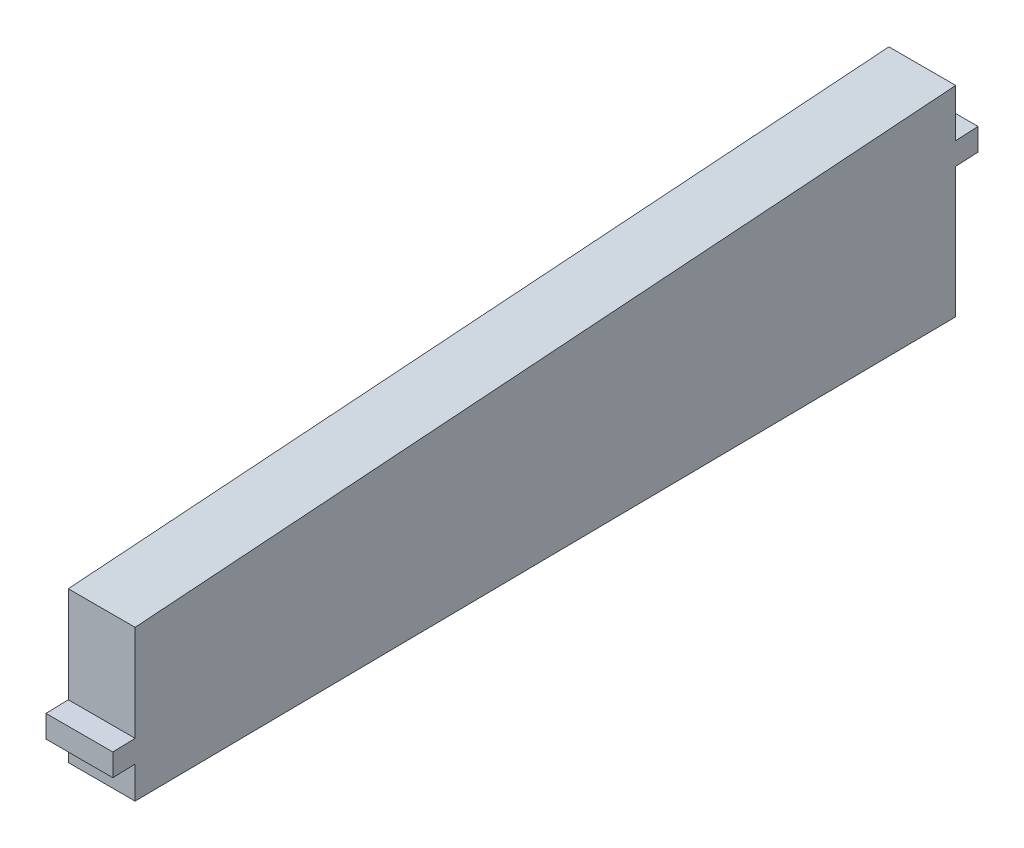
ISO-10303-21;
HEADER;
FILE_DESCRIPTION(('STEP AP214'),'2;1');
FILE_NAME('part.step','',(''),(''),'','','');
FILE_SCHEMA(('AUTOMOTIVE_DESIGN { 1 0 10303 214 1 1 1 1 }'));
ENDSEC;
DATA;
#1=APPLICATION_CONTEXT('core data for automotive mechanical design processes');
#2=APPLICATION_PROTOCOL_DEFINITION('international standard','automotive_design',2000,#1);
#3=PRODUCT_CONTEXT('',#1,'mechanical');
#4=PRODUCT('Part','Part','',(#3));
#5=PRODUCT_RELATED_PRODUCT_CATEGORY('part','',(#4));
#6=PRODUCT_DEFINITION_FORMATION('','',#4);
#7=PRODUCT_DEFINITION_CONTEXT('part definition',#1,'design');
#8=PRODUCT_DEFINITION('design','',#6,#7);
#9=PRODUCT_DEFINITION_SHAPE('','',#8);
#10=(LENGTH_UNIT() NAMED_UNIT(*) SI_UNIT(.MILLI.,.METRE.));
#11=(NAMED_UNIT(*) PLANE_ANGLE_UNIT() SI_UNIT($,.RADIAN.));
#12=(NAMED_UNIT(*) SI_UNIT($,.STERADIAN.) SOLID_ANGLE_UNIT());
#13=UNCERTAINTY_MEASURE_WITH_UNIT(LENGTH_MEASURE(1.E-05),#10,'distance_accuracy_value','');
#14=(GEOMETRIC_REPRESENTATION_CONTEXT(3) GLOBAL_UNCERTAINTY_ASSIGNED_CONTEXT((#13)) GLOBAL_UNIT_ASSIGNED_CONTEXT((#10,
#11,#12)) REPRESENTATION_CONTEXT('',''));
#15=CARTESIAN_POINT('',(0.,0.,0.));
#16=DIRECTION('',(0.,0.,1.));
#17=DIRECTION('',(1.,0.,0.));
#18=AXIS2_PLACEMENT_3D('',#15,#16,#17);
#19=CARTESIAN_POINT('',(243.017706630706,0.,0.));
#20=DIRECTION('',(1.,0.,0.));
#21=DIRECTION('',(0.,0.,-1.));
#22=AXIS2_PLACEMENT_3D('',#19,#20,#21);
#23=PLANE('',#22);
#24=DIRECTION('',(0.,-0.0302886855911997,0.999541192510423));
#25=VECTOR('',#24,1.);
#26=CARTESIAN_POINT('',(243.017706630706,362.929859581874,1377.48536065991));
#27=LINE('',#26,#25);
#28=CARTESIAN_POINT('',(243.017706630706,362.929859581874,1377.48536065991));
#29=VERTEX_POINT('',#28);
#30=CARTESIAN_POINT('',(243.017706630706,362.833648862923,1380.66036065991));
#31=VERTEX_POINT('',#30);
#32=EDGE_CURVE('E133',#29,#31,#27,.T.);
#33=ORIENTED_EDGE('',*,*,#32,.F.);
#34=DIRECTION('',(0.,-1.,0.));
#35=VECTOR('',#34,1.);
#36=CARTESIAN_POINT('',(243.017706630706,376.630450656221,1377.48536065991));
#37=LINE('',#36,#35);
#38=CARTESIAN_POINT('',(243.017706630706,376.630450656221,1377.48536065991));
#39=VERTEX_POINT('',#38);
#40=EDGE_CURVE('E169',#39,#29,#37,.T.);
#41=ORIENTED_EDGE('',*,*,#40,.F.);
#42=DIRECTION('',(0.,-0.0717092650954965,0.997425576822383));
#43=VECTOR('',#42,1.);
#44=CARTESIAN_POINT('',(243.017706630706,385.038195501593,1260.53952749591));
#45=LINE('',#44,#43);
#46=CARTESIAN_POINT('',(243.017706630706,385.038195501593,1260.53952749591));
#47=VERTEX_POINT('',#46);
#48=EDGE_CURVE('E166',#47,#39,#45,.T.);
#49=ORIENTED_EDGE('',*,*,#48,.F.);
#50=DIRECTION('',(0.,1.,0.));
#51=VECTOR('',#50,1.);
#52=CARTESIAN_POINT('',(243.017706630706,378.224679306953,1260.53952749591));
#53=LINE('',#52,#51);
#54=CARTESIAN_POINT('',(243.017706630706,378.224679306953,1260.53952749591));
#55=VERTEX_POINT('',#54);
#56=EDGE_CURVE('E163',#55,#47,#53,.T.);
#57=ORIENTED_EDGE('',*,*,#56,.F.);
#58=DIRECTION('',(0.,-0.0527109798388338,0.99860980998808));
#59=VECTOR('',#58,1.);
#60=CARTESIAN_POINT('',(243.017706630706,378.392269650363,1257.36452749591));
#61=LINE('',#60,#59);
#62=CARTESIAN_POINT('',(243.017706630706,378.392269650363,1257.36452749591));
#63=VERTEX_POINT('',#62);
#64=EDGE_CURVE('E160',#63,#55,#61,.T.);
#65=ORIENTED_EDGE('',*,*,#64,.F.);
#66=DIRECTION('',(0.,1.,0.));
#67=VECTOR('',#66,1.);
#68=CARTESIAN_POINT('',(243.017706630706,375.217269650363,1257.36452749591));
#69=LINE('',#68,#67);
#70=CARTESIAN_POINT('',(243.017706630706,375.217269650363,1257.36452749591));
#71=VERTEX_POINT('',#70);
#72=EDGE_CURVE('E157',#71,#63,#69,.T.);
#73=ORIENTED_EDGE('',*,*,#72,.F.);
#74=DIRECTION('',(0.,0.0527109798388512,-0.998609809988079));
#75=VECTOR('',#74,1.);
#76=CARTESIAN_POINT('',(243.017706630706,375.049679306953,1260.53952749591));
#77=LINE('',#76,#75);
#78=CARTESIAN_POINT('',(243.017706630706,375.049679306953,1260.53952749591));
#79=VERTEX_POINT('',#78);
#80=EDGE_CURVE('E154',#79,#71,#77,.T.);
#81=ORIENTED_EDGE('',*,*,#80,.F.);
#82=DIRECTION('',(0.,1.,0.));
#83=VECTOR('',#82,1.);
#84=CARTESIAN_POINT('',(243.017706630706,356.485104863458,1260.53952749591));
#85=LINE('',#84,#83);
#86=CARTESIAN_POINT('',(243.017706630706,356.485104863458,1260.53952749591));
#87=VERTEX_POINT('',#86);
#88=EDGE_CURVE('E151',#87,#79,#85,.T.);
#89=ORIENTED_EDGE('',*,*,#88,.F.);
#90=DIRECTION('',(0.,0.0111918961884356,-0.999937368768518));
#91=VECTOR('',#90,1.);
#92=CARTESIAN_POINT('',(243.017706630706,355.176177259268,1377.48536065991));
#93=LINE('',#92,#91);
#94=CARTESIAN_POINT('',(243.017706630706,355.176177259268,1377.48536065991));
#95=VERTEX_POINT('',#94);
#96=EDGE_CURVE('E148',#95,#87,#93,.T.);
#97=ORIENTED_EDGE('',*,*,#96,.F.);
#98=DIRECTION('',(0.,-1.,0.));
#99=VECTOR('',#98,1.);
#100=CARTESIAN_POINT('',(243.017706630706,355.176177259268,1377.48536065991));
#101=LINE('',#100,#99);
#102=CARTESIAN_POINT('',(243.017706630706,359.754859581874,1377.48536065991));
#103=VERTEX_POINT('',#102);
#104=EDGE_CURVE('E145',#103,#95,#101,.T.);
#105=ORIENTED_EDGE('',*,*,#104,.F.);
#106=DIRECTION('',(0.,0.0302886855911997,-0.999541192510423));
#107=VECTOR('',#106,1.);
#108=CARTESIAN_POINT('',(243.017706630706,359.658648862923,1380.66036065991));
#109=LINE('',#108,#107);
#110=CARTESIAN_POINT('',(243.017706630706,359.658648862923,1380.66036065991));
#111=VERTEX_POINT('',#110);
#112=EDGE_CURVE('E136',#111,#103,#109,.T.);
#113=ORIENTED_EDGE('',*,*,#112,.F.);
#114=DIRECTION('',(0.,-1.,0.));
#115=VECTOR('',#114,1.);
#116=CARTESIAN_POINT('',(243.017706630706,362.833648862923,1380.66036065991));
#117=LINE('',#116,#115);
#118=EDGE_CURVE('E125',#31,#111,#117,.T.);
#119=ORIENTED_EDGE('',*,*,#118,.F.);
#120=EDGE_LOOP('',(#33,#41,#49,#57,#65,#73,#81,#89,#97,#105,#113,#119));
#121=FACE_BOUND('',#120,.T.);
#122=ADVANCED_FACE('F33',(#121),#23,.F.);
#123=CARTESIAN_POINT('',(379.40327027879,376.630450656221,1377.48536065991));
#124=DIRECTION('',(0.,0.,-1.));
#125=DIRECTION('',(-1.,0.,0.));
#126=AXIS2_PLACEMENT_3D('',#123,#124,#125);
#127=PLANE('',#126);
#128=DIRECTION('',(-1.,0.,0.));
#129=VECTOR('',#128,1.);
#130=CARTESIAN_POINT('',(379.40327027879,362.929859581874,1377.48536065991));
#131=LINE('',#130,#129);
#132=CARTESIAN_POINT('',(252.542706630704,362.929859581874,1377.48536065991));
#133=VERTEX_POINT('',#132);
#134=EDGE_CURVE('E139',#133,#29,#131,.T.);
#135=ORIENTED_EDGE('',*,*,#134,.F.);
#136=DIRECTION('',(0.,1.,0.));
#137=VECTOR('',#136,1.);
#138=CARTESIAN_POINT('',(252.542706630704,376.630450656221,1377.48536065991));
#139=LINE('',#138,#137);
#140=CARTESIAN_POINT('',(252.542706630704,376.630450656221,1377.48536065991));
#141=VERTEX_POINT('',#140);
#142=EDGE_CURVE('E37',#133,#141,#139,.T.);
#143=ORIENTED_EDGE('',*,*,#142,.T.);
#144=DIRECTION('',(-1.,0.,0.));
#145=VECTOR('',#144,1.);
#146=CARTESIAN_POINT('',(379.40327027879,376.630450656221,1377.48536065991));
#147=LINE('',#146,#145);
#148=EDGE_CURVE('E172',#141,#39,#147,.T.);
#149=ORIENTED_EDGE('',*,*,#148,.T.);
#150=ORIENTED_EDGE('',*,*,#40,.T.);
#151=EDGE_LOOP('',(#135,#143,#149,#150));
#152=FACE_BOUND('',#151,.T.);
#153=ADVANCED_FACE('F221',(#152),#127,.F.);
#154=CARTESIAN_POINT('',(379.40327027879,385.038195501593,1260.53952749591));
#155=DIRECTION('',(0.,-0.997425576822383,-0.0717092650954965));
#156=DIRECTION('',(0.,0.0717092650954965,-0.997425576822383));
#157=AXIS2_PLACEMENT_3D('',#154,#155,#156);
#158=PLANE('',#157);
#159=ORIENTED_EDGE('',*,*,#148,.F.);
#160=DIRECTION('',(0.,0.0717092650954965,-0.997425576822383));
#161=VECTOR('',#160,1.);
#162=CARTESIAN_POINT('',(252.542706630704,385.038195501593,1260.53952749591));
#163=LINE('',#162,#161);
#164=CARTESIAN_POINT('',(252.542706630704,385.038195501593,1260.53952749591));
#165=VERTEX_POINT('',#164);
#166=EDGE_CURVE('E215',#141,#165,#163,.T.);
#167=ORIENTED_EDGE('',*,*,#166,.T.);
#168=DIRECTION('',(-1.,0.,0.));
#169=VECTOR('',#168,1.);
#170=CARTESIAN_POINT('',(379.40327027879,385.038195501593,1260.53952749591));
#171=LINE('',#170,#169);
#172=EDGE_CURVE('E174',#165,#47,#171,.T.);
#173=ORIENTED_EDGE('',*,*,#172,.T.);
#174=ORIENTED_EDGE('',*,*,#48,.T.);
#175=EDGE_LOOP('',(#159,#167,#173,#174));
#176=FACE_BOUND('',#175,.T.);
#177=ADVANCED_FACE('F224',(#176),#158,.F.);
#178=CARTESIAN_POINT('',(379.40327027879,378.224679306953,1260.53952749591));
#179=DIRECTION('',(0.,0.,1.));
#180=DIRECTION('',(0.,-1.,0.));
#181=AXIS2_PLACEMENT_3D('',#178,#179,#180);
#182=PLANE('',#181);
#183=ORIENTED_EDGE('',*,*,#172,.F.);
#184=DIRECTION('',(0.,-1.,0.));
#185=VECTOR('',#184,1.);
#186=CARTESIAN_POINT('',(252.542706630704,378.224679306953,1260.53952749591));
#187=LINE('',#186,#185);
#188=CARTESIAN_POINT('',(252.542706630704,378.224679306953,1260.53952749591));
#189=VERTEX_POINT('',#188);
#190=EDGE_CURVE('E212',#165,#189,#187,.T.);
#191=ORIENTED_EDGE('',*,*,#190,.T.);
#192=DIRECTION('',(-1.,0.,0.));
#193=VECTOR('',#192,1.);
#194=CARTESIAN_POINT('',(379.40327027879,378.224679306953,1260.53952749591));
#195=LINE('',#194,#193);
#196=EDGE_CURVE('E176',#189,#55,#195,.T.);
#197=ORIENTED_EDGE('',*,*,#196,.T.);
#198=ORIENTED_EDGE('',*,*,#56,.T.);
#199=EDGE_LOOP('',(#183,#191,#197,#198));
#200=FACE_BOUND('',#199,.T.);
#201=ADVANCED_FACE('F230',(#200),#182,.F.);
#202=CARTESIAN_POINT('',(379.40327027879,378.392269650363,1257.36452749591));
#203=DIRECTION('',(0.,-0.99860980998808,-0.0527109798388338));
#204=DIRECTION('',(0.,0.0527109798388338,-0.998609809988081));
#205=AXIS2_PLACEMENT_3D('',#202,#203,#204);
#206=PLANE('',#205);
#207=ORIENTED_EDGE('',*,*,#196,.F.);
#208=DIRECTION('',(0.,0.0527109798388338,-0.99860980998808));
#209=VECTOR('',#208,1.);
#210=CARTESIAN_POINT('',(252.542706630704,378.392269650363,1257.36452749591));
#211=LINE('',#210,#209);
#212=CARTESIAN_POINT('',(252.542706630704,378.392269650363,1257.36452749591));
#213=VERTEX_POINT('',#212);
#214=EDGE_CURVE('E209',#189,#213,#211,.T.);
#215=ORIENTED_EDGE('',*,*,#214,.T.);
#216=DIRECTION('',(-1.,0.,0.));
#217=VECTOR('',#216,1.);
#218=CARTESIAN_POINT('',(379.40327027879,378.392269650363,1257.36452749591));
#219=LINE('',#218,#217);
#220=EDGE_CURVE('E178',#213,#63,#219,.T.);
#221=ORIENTED_EDGE('',*,*,#220,.T.);
#222=ORIENTED_EDGE('',*,*,#64,.T.);
#223=EDGE_LOOP('',(#207,#215,#221,#222));
#224=FACE_BOUND('',#223,.T.);
#225=ADVANCED_FACE('F233',(#224),#206,.F.);
#226=CARTESIAN_POINT('',(379.40327027879,375.217269650363,1257.36452749591));
#227=DIRECTION('',(0.,0.,1.));
#228=DIRECTION('',(1.,0.,0.));
#229=AXIS2_PLACEMENT_3D('',#226,#227,#228);
#230=PLANE('',#229);
#231=ORIENTED_EDGE('',*,*,#220,.F.);
#232=DIRECTION('',(0.,-1.,0.));
#233=VECTOR('',#232,1.);
#234=CARTESIAN_POINT('',(252.542706630704,375.217269650363,1257.36452749591));
#235=LINE('',#234,#233);
#236=CARTESIAN_POINT('',(252.542706630704,375.217269650363,1257.36452749591));
#237=VERTEX_POINT('',#236);
#238=EDGE_CURVE('E206',#213,#237,#235,.T.);
#239=ORIENTED_EDGE('',*,*,#238,.T.);
#240=DIRECTION('',(-1.,0.,0.));
#241=VECTOR('',#240,1.);
#242=CARTESIAN_POINT('',(379.40327027879,375.217269650363,1257.36452749591));
#243=LINE('',#242,#241);
#244=EDGE_CURVE('E180',#237,#71,#243,.T.);
#245=ORIENTED_EDGE('',*,*,#244,.T.);
#246=ORIENTED_EDGE('',*,*,#72,.T.);
#247=EDGE_LOOP('',(#231,#239,#245,#246));
#248=FACE_BOUND('',#247,.T.);
#249=ADVANCED_FACE('F236',(#248),#230,.F.);
#250=CARTESIAN_POINT('',(379.40327027879,375.049679306953,1260.53952749591));
#251=DIRECTION('',(0.,0.99860980998808,0.0527109798388512));
#252=DIRECTION('',(0.,-0.0527109798388512,0.99860980998808));
#253=AXIS2_PLACEMENT_3D('',#250,#251,#252);
#254=PLANE('',#253);
#255=ORIENTED_EDGE('',*,*,#244,.F.);
#256=DIRECTION('',(0.,-0.0527109798388512,0.99860980998808));
#257=VECTOR('',#256,1.);
#258=CARTESIAN_POINT('',(252.542706630704,375.049679306953,1260.53952749591));
#259=LINE('',#258,#257);
#260=CARTESIAN_POINT('',(252.542706630704,375.049679306953,1260.53952749591));
#261=VERTEX_POINT('',#260);
#262=EDGE_CURVE('E203',#237,#261,#259,.T.);
#263=ORIENTED_EDGE('',*,*,#262,.T.);
#264=DIRECTION('',(-1.,0.,0.));
#265=VECTOR('',#264,1.);
#266=CARTESIAN_POINT('',(379.40327027879,375.049679306953,1260.53952749591));
#267=LINE('',#266,#265);
#268=EDGE_CURVE('E182',#261,#79,#267,.T.);
#269=ORIENTED_EDGE('',*,*,#268,.T.);
#270=ORIENTED_EDGE('',*,*,#80,.T.);
#271=EDGE_LOOP('',(#255,#263,#269,#270));
#272=FACE_BOUND('',#271,.T.);
#273=ADVANCED_FACE('F242',(#272),#254,.F.);
#274=CARTESIAN_POINT('',(379.40327027879,356.485104863458,1260.53952749591));
#275=DIRECTION('',(0.,0.,1.));
#276=DIRECTION('',(0.,-1.,0.));
#277=AXIS2_PLACEMENT_3D('',#274,#275,#276);
#278=PLANE('',#277);
#279=ORIENTED_EDGE('',*,*,#268,.F.);
#280=DIRECTION('',(0.,-1.,0.));
#281=VECTOR('',#280,1.);
#282=CARTESIAN_POINT('',(252.542706630704,356.485104863458,1260.53952749591));
#283=LINE('',#282,#281);
#284=CARTESIAN_POINT('',(252.542706630704,356.485104863458,1260.53952749591));
#285=VERTEX_POINT('',#284);
#286=EDGE_CURVE('E200',#261,#285,#283,.T.);
#287=ORIENTED_EDGE('',*,*,#286,.T.);
#288=DIRECTION('',(-1.,0.,0.));
#289=VECTOR('',#288,1.);
#290=CARTESIAN_POINT('',(379.40327027879,356.485104863458,1260.53952749591));
#291=LINE('',#290,#289);
#292=EDGE_CURVE('E184',#285,#87,#291,.T.);
#293=ORIENTED_EDGE('',*,*,#292,.T.);
#294=ORIENTED_EDGE('',*,*,#88,.T.);
#295=EDGE_LOOP('',(#279,#287,#293,#294));
#296=FACE_BOUND('',#295,.T.);
#297=ADVANCED_FACE('F245',(#296),#278,.F.);
#298=CARTESIAN_POINT('',(379.40327027879,355.176177259268,1377.48536065991));
#299=DIRECTION('',(0.,0.999937368768518,0.0111918961884356));
#300=DIRECTION('',(0.,-0.0111918961884356,0.999937368768518));
#301=AXIS2_PLACEMENT_3D('',#298,#299,#300);
#302=PLANE('',#301);
#303=ORIENTED_EDGE('',*,*,#292,.F.);
#304=DIRECTION('',(0.,-0.0111918961884356,0.999937368768518));
#305=VECTOR('',#304,1.);
#306=CARTESIAN_POINT('',(252.542706630704,355.176177259268,1377.48536065991));
#307=LINE('',#306,#305);
#308=CARTESIAN_POINT('',(252.542706630704,355.176177259268,1377.48536065991));
#309=VERTEX_POINT('',#308);
#310=EDGE_CURVE('E195',#285,#309,#307,.T.);
#311=ORIENTED_EDGE('',*,*,#310,.T.);
#312=DIRECTION('',(-1.,0.,0.));
#313=VECTOR('',#312,1.);
#314=CARTESIAN_POINT('',(379.40327027879,355.176177259268,1377.48536065991));
#315=LINE('',#314,#313);
#316=EDGE_CURVE('E186',#309,#95,#315,.T.);
#317=ORIENTED_EDGE('',*,*,#316,.T.);
#318=ORIENTED_EDGE('',*,*,#96,.T.);
#319=EDGE_LOOP('',(#303,#311,#317,#318));
#320=FACE_BOUND('',#319,.T.);
#321=ADVANCED_FACE('F248',(#320),#302,.F.);
#322=CARTESIAN_POINT('',(379.40327027879,355.176177259268,1377.48536065991));
#323=DIRECTION('',(0.,0.,-1.));
#324=DIRECTION('',(-1.,0.,0.));
#325=AXIS2_PLACEMENT_3D('',#322,#323,#324);
#326=PLANE('',#325);
#327=ORIENTED_EDGE('',*,*,#316,.F.);
#328=DIRECTION('',(0.,1.,0.));
#329=VECTOR('',#328,1.);
#330=CARTESIAN_POINT('',(252.542706630704,355.176177259268,1377.48536065991));
#331=LINE('',#330,#329);
#332=CARTESIAN_POINT('',(252.542706630704,359.754859581874,1377.48536065991));
#333=VERTEX_POINT('',#332);
#334=EDGE_CURVE('E193',#309,#333,#331,.T.);
#335=ORIENTED_EDGE('',*,*,#334,.T.);
#336=DIRECTION('',(-1.,0.,0.));
#337=VECTOR('',#336,1.);
#338=CARTESIAN_POINT('',(379.40327027879,359.754859581874,1377.48536065991));
#339=LINE('',#338,#337);
#340=EDGE_CURVE('E188',#333,#103,#339,.T.);
#341=ORIENTED_EDGE('',*,*,#340,.T.);
#342=ORIENTED_EDGE('',*,*,#104,.T.);
#343=EDGE_LOOP('',(#327,#335,#341,#342));
#344=FACE_BOUND('',#343,.T.);
#345=ADVANCED_FACE('F251',(#344),#326,.F.);
#346=CARTESIAN_POINT('',(379.40327027879,359.658648862923,1380.66036065991));
#347=DIRECTION('',(0.,0.999541192510422,0.0302886855911997));
#348=DIRECTION('',(0.,-0.0302886855911997,0.999541192510423));
#349=AXIS2_PLACEMENT_3D('',#346,#347,#348);
#350=PLANE('',#349);
#351=ORIENTED_EDGE('',*,*,#340,.F.);
#352=DIRECTION('',(0.,-0.0302886855911997,0.999541192510423));
#353=VECTOR('',#352,1.);
#354=CARTESIAN_POINT('',(252.542706630704,359.658648862923,1380.66036065991));
#355=LINE('',#354,#353);
#356=CARTESIAN_POINT('',(252.542706630704,359.658648862923,1380.66036065991));
#357=VERTEX_POINT('',#356);
#358=EDGE_CURVE('E54',#333,#357,#355,.T.);
#359=ORIENTED_EDGE('',*,*,#358,.T.);
#360=DIRECTION('',(-1.,0.,0.));
#361=VECTOR('',#360,1.);
#362=CARTESIAN_POINT('',(379.40327027879,359.658648862923,1380.66036065991));
#363=LINE('',#362,#361);
#364=EDGE_CURVE('E129',#357,#111,#363,.T.);
#365=ORIENTED_EDGE('',*,*,#364,.T.);
#366=ORIENTED_EDGE('',*,*,#112,.T.);
#367=EDGE_LOOP('',(#351,#359,#365,#366));
#368=FACE_BOUND('',#367,.T.);
#369=ADVANCED_FACE('F191',(#368),#350,.F.);
#370=CARTESIAN_POINT('',(379.40327027879,362.833648862923,1380.66036065991));
#371=DIRECTION('',(0.,0.,-1.));
#372=DIRECTION('',(-1.,0.,0.));
#373=AXIS2_PLACEMENT_3D('',#370,#371,#372);
#374=PLANE('',#373);
#375=ORIENTED_EDGE('',*,*,#364,.F.);
#376=DIRECTION('',(0.,1.,0.));
#377=VECTOR('',#376,1.);
#378=CARTESIAN_POINT('',(252.542706630704,362.833648862923,1380.66036065991));
#379=LINE('',#378,#377);
#380=CARTESIAN_POINT('',(252.542706630704,362.833648862923,1380.66036065991));
#381=VERTEX_POINT('',#380);
#382=EDGE_CURVE('E42',#357,#381,#379,.T.);
#383=ORIENTED_EDGE('',*,*,#382,.T.);
#384=DIRECTION('',(-1.,0.,0.));
#385=VECTOR('',#384,1.);
#386=CARTESIAN_POINT('',(379.40327027879,362.833648862923,1380.66036065991));
#387=LINE('',#386,#385);
#388=EDGE_CURVE('E122',#381,#31,#387,.T.);
#389=ORIENTED_EDGE('',*,*,#388,.T.);
#390=ORIENTED_EDGE('',*,*,#118,.T.);
#391=EDGE_LOOP('',(#375,#383,#389,#390));
#392=FACE_BOUND('',#391,.T.);
#393=ADVANCED_FACE('F124',(#392),#374,.F.);
#394=CARTESIAN_POINT('',(379.40327027879,362.929859581874,1377.48536065991));
#395=DIRECTION('',(0.,-0.999541192510422,-0.0302886855911997));
#396=DIRECTION('',(0.,0.0302886855911997,-0.999541192510423));
#397=AXIS2_PLACEMENT_3D('',#394,#395,#396);
#398=PLANE('',#397);
#399=ORIENTED_EDGE('',*,*,#388,.F.);
#400=DIRECTION('',(0.,0.0302886855911997,-0.999541192510423));
#401=VECTOR('',#400,1.);
#402=CARTESIAN_POINT('',(252.542706630704,362.929859581874,1377.48536065991));
#403=LINE('',#402,#401);
#404=EDGE_CURVE('E11',#381,#133,#403,.T.);
#405=ORIENTED_EDGE('',*,*,#404,.T.);
#406=ORIENTED_EDGE('',*,*,#134,.T.);
#407=ORIENTED_EDGE('',*,*,#32,.T.);
#408=EDGE_LOOP('',(#399,#405,#406,#407));
#409=FACE_BOUND('',#408,.T.);
#410=ADVANCED_FACE('F35',(#409),#398,.F.);
#411=CARTESIAN_POINT('',(252.542706630704,344.834338896103,776.88119407791));
#412=DIRECTION('',(-1.,0.,0.));
#413=DIRECTION('',(0.,0.,1.));
#414=AXIS2_PLACEMENT_3D('',#411,#412,#413);
#415=PLANE('',#414);
#416=ORIENTED_EDGE('',*,*,#382,.F.);
#417=ORIENTED_EDGE('',*,*,#358,.F.);
#418=ORIENTED_EDGE('',*,*,#334,.F.);
#419=ORIENTED_EDGE('',*,*,#310,.F.);
#420=ORIENTED_EDGE('',*,*,#286,.F.);
#421=ORIENTED_EDGE('',*,*,#262,.F.);
#422=ORIENTED_EDGE('',*,*,#238,.F.);
#423=ORIENTED_EDGE('',*,*,#214,.F.);
#424=ORIENTED_EDGE('',*,*,#190,.F.);
#425=ORIENTED_EDGE('',*,*,#166,.F.);
#426=ORIENTED_EDGE('',*,*,#142,.F.);
#427=ORIENTED_EDGE('',*,*,#404,.F.);
#428=EDGE_LOOP('',(#416,#417,#418,#419,#420,#421,#422,#423,#424,#425,#426,#427));
#429=FACE_BOUND('',#428,.T.);
#430=ADVANCED_FACE('F222',(#429),#415,.F.);
#431=CLOSED_SHELL('',(#122,#153,#177,#201,#225,#249,#273,#297,#321,#345,#369,#393,#410,#430));
#432=MANIFOLD_SOLID_BREP('B2',#431);
#433=ADVANCED_BREP_SHAPE_REPRESENTATION('',(#18,#432),#14);
#434=SHAPE_DEFINITION_REPRESENTATION(#9,#433);
ENDSEC;
END-ISO-10303-21;
